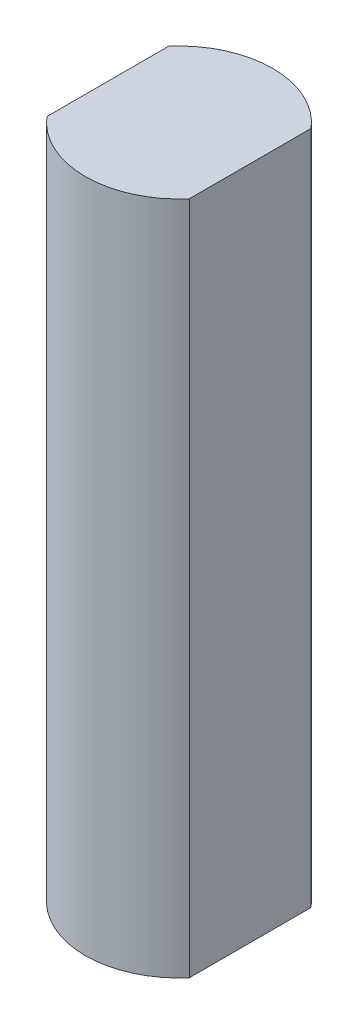
ISO-10303-21;
HEADER;
FILE_DESCRIPTION(('STEP AP214'),'2;1');
FILE_NAME('part.step','',(''),(''),'','','');
FILE_SCHEMA(('AUTOMOTIVE_DESIGN { 1 0 10303 214 1 1 1 1 }'));
ENDSEC;
DATA;
#1=APPLICATION_CONTEXT('core data for automotive mechanical design processes');
#2=APPLICATION_PROTOCOL_DEFINITION('international standard','automotive_design',2000,#1);
#3=PRODUCT_CONTEXT('',#1,'mechanical');
#4=PRODUCT('Part','Part','',(#3));
#5=PRODUCT_RELATED_PRODUCT_CATEGORY('part','',(#4));
#6=PRODUCT_DEFINITION_FORMATION('','',#4);
#7=PRODUCT_DEFINITION_CONTEXT('part definition',#1,'design');
#8=PRODUCT_DEFINITION('design','',#6,#7);
#9=PRODUCT_DEFINITION_SHAPE('','',#8);
#10=(LENGTH_UNIT() NAMED_UNIT(*) SI_UNIT(.MILLI.,.METRE.));
#11=(NAMED_UNIT(*) PLANE_ANGLE_UNIT() SI_UNIT($,.RADIAN.));
#12=(NAMED_UNIT(*) SI_UNIT($,.STERADIAN.) SOLID_ANGLE_UNIT());
#13=UNCERTAINTY_MEASURE_WITH_UNIT(LENGTH_MEASURE(1.E-05),#10,'distance_accuracy_value','');
#14=(GEOMETRIC_REPRESENTATION_CONTEXT(3) GLOBAL_UNCERTAINTY_ASSIGNED_CONTEXT((#13)) GLOBAL_UNIT_ASSIGNED_CONTEXT((#10,
#11,#12)) REPRESENTATION_CONTEXT('',''));
#15=CARTESIAN_POINT('',(0.,0.,0.));
#16=DIRECTION('',(0.,0.,1.));
#17=DIRECTION('',(1.,0.,0.));
#18=AXIS2_PLACEMENT_3D('',#15,#16,#17);
#19=CARTESIAN_POINT('',(0.,18.,0.));
#20=DIRECTION('',(0.,-1.,0.));
#21=DIRECTION('',(0.,0.,-1.));
#22=AXIS2_PLACEMENT_3D('',#19,#20,#21);
#23=CYLINDRICAL_SURFACE('',#22,2.5);
#24=CARTESIAN_POINT('',(0.,0.,0.));
#25=DIRECTION('',(0.,1.,0.));
#26=DIRECTION('',(0.,0.,1.));
#27=AXIS2_PLACEMENT_3D('',#24,#25,#26);
#28=CIRCLE('',#27,2.5);
#29=CARTESIAN_POINT('',(-1.9,0.,1.62480768092719));
#30=VERTEX_POINT('',#29);
#31=CARTESIAN_POINT('',(1.9,0.,1.62480768092719));
#32=VERTEX_POINT('',#31);
#33=EDGE_CURVE('E97',#30,#32,#28,.T.);
#34=ORIENTED_EDGE('',*,*,#33,.T.);
#35=DIRECTION('',(0.,-1.,0.));
#36=VECTOR('',#35,1.);
#37=CARTESIAN_POINT('',(1.9,18.,1.62480768092719));
#38=LINE('',#37,#36);
#39=CARTESIAN_POINT('',(1.9,18.,1.62480768092719));
#40=VERTEX_POINT('',#39);
#41=EDGE_CURVE('E11',#40,#32,#38,.T.);
#42=ORIENTED_EDGE('',*,*,#41,.F.);
#43=CARTESIAN_POINT('',(0.,18.,0.));
#44=DIRECTION('',(0.,1.,0.));
#45=DIRECTION('',(0.,0.,1.));
#46=AXIS2_PLACEMENT_3D('',#43,#44,#45);
#47=CIRCLE('',#46,2.5);
#48=CARTESIAN_POINT('',(-1.9,18.,1.62480768092719));
#49=VERTEX_POINT('',#48);
#50=EDGE_CURVE('E83',#49,#40,#47,.T.);
#51=ORIENTED_EDGE('',*,*,#50,.F.);
#52=DIRECTION('',(0.,-1.,0.));
#53=VECTOR('',#52,1.);
#54=CARTESIAN_POINT('',(-1.9,18.,1.62480768092719));
#55=LINE('',#54,#53);
#56=EDGE_CURVE('E50',#49,#30,#55,.T.);
#57=ORIENTED_EDGE('',*,*,#56,.T.);
#58=EDGE_LOOP('',(#34,#42,#51,#57));
#59=FACE_BOUND('',#58,.T.);
#60=ADVANCED_FACE('F34',(#59),#23,.T.);
#61=CARTESIAN_POINT('',(1.9,18.,1.62480768092719));
#62=DIRECTION('',(-1.,0.,0.));
#63=DIRECTION('',(0.,0.,1.));
#64=AXIS2_PLACEMENT_3D('',#61,#62,#63);
#65=PLANE('',#64);
#66=DIRECTION('',(0.,0.,-1.));
#67=VECTOR('',#66,1.);
#68=CARTESIAN_POINT('',(1.9,0.,1.62480768092719));
#69=LINE('',#68,#67);
#70=CARTESIAN_POINT('',(1.9,0.,-1.62480768092719));
#71=VERTEX_POINT('',#70);
#72=EDGE_CURVE('E88',#32,#71,#69,.T.);
#73=ORIENTED_EDGE('',*,*,#72,.T.);
#74=DIRECTION('',(0.,-1.,0.));
#75=VECTOR('',#74,1.);
#76=CARTESIAN_POINT('',(1.9,18.,-1.62480768092719));
#77=LINE('',#76,#75);
#78=CARTESIAN_POINT('',(1.9,18.,-1.62480768092719));
#79=VERTEX_POINT('',#78);
#80=EDGE_CURVE('E42',#79,#71,#77,.T.);
#81=ORIENTED_EDGE('',*,*,#80,.F.);
#82=DIRECTION('',(0.,0.,-1.));
#83=VECTOR('',#82,1.);
#84=CARTESIAN_POINT('',(1.9,18.,1.62480768092719));
#85=LINE('',#84,#83);
#86=EDGE_CURVE('E76',#40,#79,#85,.T.);
#87=ORIENTED_EDGE('',*,*,#86,.F.);
#88=ORIENTED_EDGE('',*,*,#41,.T.);
#89=EDGE_LOOP('',(#73,#81,#87,#88));
#90=FACE_BOUND('',#89,.T.);
#91=ADVANCED_FACE('F87',(#90),#65,.F.);
#92=CARTESIAN_POINT('',(0.,18.,0.));
#93=DIRECTION('',(0.,-1.,0.));
#94=DIRECTION('',(0.,0.,-1.));
#95=AXIS2_PLACEMENT_3D('',#92,#93,#94);
#96=CYLINDRICAL_SURFACE('',#95,2.5);
#97=CARTESIAN_POINT('',(0.,0.,0.));
#98=DIRECTION('',(0.,1.,0.));
#99=DIRECTION('',(0.,0.,1.));
#100=AXIS2_PLACEMENT_3D('',#97,#98,#99);
#101=CIRCLE('',#100,2.5);
#102=CARTESIAN_POINT('',(-1.9,0.,-1.62480768092719));
#103=VERTEX_POINT('',#102);
#104=EDGE_CURVE('E100',#71,#103,#101,.T.);
#105=ORIENTED_EDGE('',*,*,#104,.T.);
#106=DIRECTION('',(0.,-1.,0.));
#107=VECTOR('',#106,1.);
#108=CARTESIAN_POINT('',(-1.9,18.,-1.62480768092719));
#109=LINE('',#108,#107);
#110=CARTESIAN_POINT('',(-1.9,18.,-1.62480768092719));
#111=VERTEX_POINT('',#110);
#112=EDGE_CURVE('E65',#111,#103,#109,.T.);
#113=ORIENTED_EDGE('',*,*,#112,.F.);
#114=CARTESIAN_POINT('',(0.,18.,0.));
#115=DIRECTION('',(0.,1.,0.));
#116=DIRECTION('',(0.,0.,1.));
#117=AXIS2_PLACEMENT_3D('',#114,#115,#116);
#118=CIRCLE('',#117,2.5);
#119=EDGE_CURVE('E82',#79,#111,#118,.T.);
#120=ORIENTED_EDGE('',*,*,#119,.F.);
#121=ORIENTED_EDGE('',*,*,#80,.T.);
#122=EDGE_LOOP('',(#105,#113,#120,#121));
#123=FACE_BOUND('',#122,.T.);
#124=ADVANCED_FACE('F91',(#123),#96,.T.);
#125=CARTESIAN_POINT('',(-1.9,18.,1.62480768092719));
#126=DIRECTION('',(-1.,0.,0.));
#127=DIRECTION('',(0.,0.,1.));
#128=AXIS2_PLACEMENT_3D('',#125,#126,#127);
#129=PLANE('',#128);
#130=DIRECTION('',(0.,0.,-1.));
#131=VECTOR('',#130,1.);
#132=CARTESIAN_POINT('',(-1.9,0.,1.62480768092719));
#133=LINE('',#132,#131);
#134=EDGE_CURVE('E102',#30,#103,#133,.T.);
#135=ORIENTED_EDGE('',*,*,#134,.F.);
#136=ORIENTED_EDGE('',*,*,#56,.F.);
#137=DIRECTION('',(0.,0.,-1.));
#138=VECTOR('',#137,1.);
#139=CARTESIAN_POINT('',(-1.9,18.,1.62480768092719));
#140=LINE('',#139,#138);
#141=EDGE_CURVE('E92',#49,#111,#140,.T.);
#142=ORIENTED_EDGE('',*,*,#141,.T.);
#143=ORIENTED_EDGE('',*,*,#112,.T.);
#144=EDGE_LOOP('',(#135,#136,#142,#143));
#145=FACE_BOUND('',#144,.T.);
#146=ADVANCED_FACE('F108',(#145),#129,.T.);
#147=CARTESIAN_POINT('',(0.,18.,0.));
#148=DIRECTION('',(0.,1.,0.));
#149=DIRECTION('',(0.,0.,1.));
#150=AXIS2_PLACEMENT_3D('',#147,#148,#149);
#151=PLANE('',#150);
#152=ORIENTED_EDGE('',*,*,#50,.T.);
#153=ORIENTED_EDGE('',*,*,#86,.T.);
#154=ORIENTED_EDGE('',*,*,#119,.T.);
#155=ORIENTED_EDGE('',*,*,#141,.F.);
#156=EDGE_LOOP('',(#152,#153,#154,#155));
#157=FACE_BOUND('',#156,.T.);
#158=ADVANCED_FACE('F79',(#157),#151,.T.);
#159=CARTESIAN_POINT('',(0.,0.,0.));
#160=DIRECTION('',(0.,1.,0.));
#161=DIRECTION('',(0.,0.,1.));
#162=AXIS2_PLACEMENT_3D('',#159,#160,#161);
#163=PLANE('',#162);
#164=ORIENTED_EDGE('',*,*,#33,.F.);
#165=ORIENTED_EDGE('',*,*,#134,.T.);
#166=ORIENTED_EDGE('',*,*,#104,.F.);
#167=ORIENTED_EDGE('',*,*,#72,.F.);
#168=EDGE_LOOP('',(#164,#165,#166,#167));
#169=FACE_BOUND('',#168,.T.);
#170=ADVANCED_FACE('F107',(#169),#163,.F.);
#171=CLOSED_SHELL('',(#60,#91,#124,#146,#158,#170));
#172=MANIFOLD_SOLID_BREP('B2',#171);
#173=ADVANCED_BREP_SHAPE_REPRESENTATION('',(#18,#172),#14);
#174=SHAPE_DEFINITION_REPRESENTATION(#9,#173);
ENDSEC;
END-ISO-10303-21;
